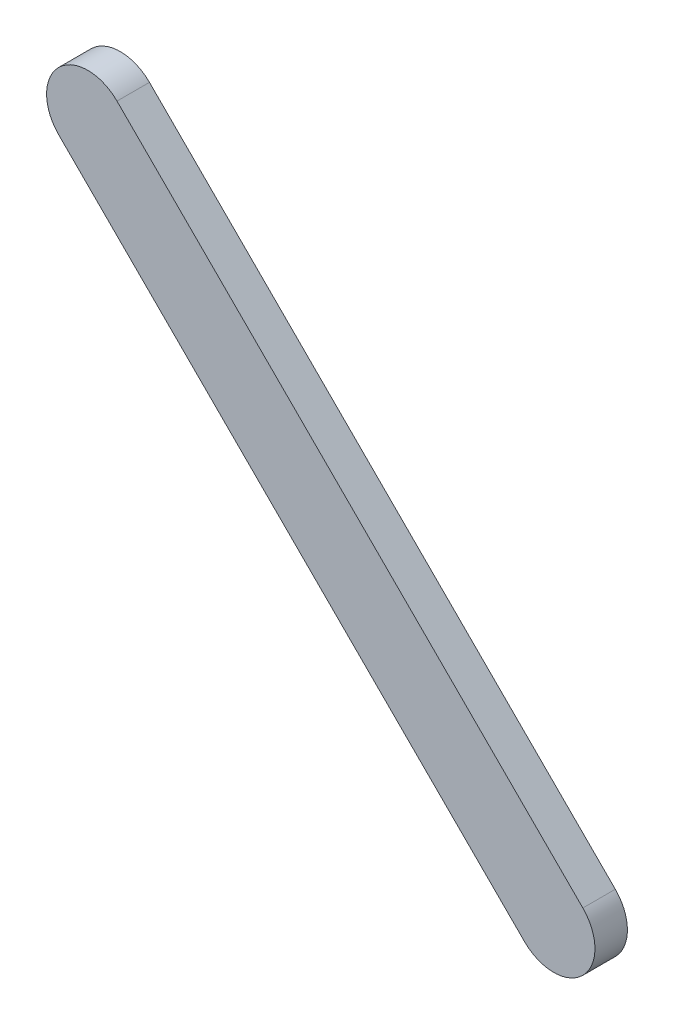
ISO-10303-21;
HEADER;
FILE_DESCRIPTION(('STEP AP214'),'2;1');
FILE_NAME('part.step','',(''),(''),'','','');
FILE_SCHEMA(('AUTOMOTIVE_DESIGN { 1 0 10303 214 1 1 1 1 }'));
ENDSEC;
DATA;
#1=APPLICATION_CONTEXT('core data for automotive mechanical design processes');
#2=APPLICATION_PROTOCOL_DEFINITION('international standard','automotive_design',2000,#1);
#3=PRODUCT_CONTEXT('',#1,'mechanical');
#4=PRODUCT('Part','Part','',(#3));
#5=PRODUCT_RELATED_PRODUCT_CATEGORY('part','',(#4));
#6=PRODUCT_DEFINITION_FORMATION('','',#4);
#7=PRODUCT_DEFINITION_CONTEXT('part definition',#1,'design');
#8=PRODUCT_DEFINITION('design','',#6,#7);
#9=PRODUCT_DEFINITION_SHAPE('','',#8);
#10=(LENGTH_UNIT() NAMED_UNIT(*) SI_UNIT(.MILLI.,.METRE.));
#11=(NAMED_UNIT(*) PLANE_ANGLE_UNIT() SI_UNIT($,.RADIAN.));
#12=(NAMED_UNIT(*) SI_UNIT($,.STERADIAN.) SOLID_ANGLE_UNIT());
#13=UNCERTAINTY_MEASURE_WITH_UNIT(LENGTH_MEASURE(1.E-05),#10,'distance_accuracy_value','');
#14=(GEOMETRIC_REPRESENTATION_CONTEXT(3) GLOBAL_UNCERTAINTY_ASSIGNED_CONTEXT((#13)) GLOBAL_UNIT_ASSIGNED_CONTEXT((#10,
#11,#12)) REPRESENTATION_CONTEXT('',''));
#15=CARTESIAN_POINT('',(0.,0.,0.));
#16=DIRECTION('',(0.,0.,1.));
#17=DIRECTION('',(1.,0.,0.));
#18=AXIS2_PLACEMENT_3D('',#15,#16,#17);
#19=CARTESIAN_POINT('',(146.25139406,59.3325966,0.));
#20=DIRECTION('',(0.707106781186548,0.707106781186548,0.));
#21=DIRECTION('',(0.707106781186548,-0.707106781186548,0.));
#22=AXIS2_PLACEMENT_3D('',#19,#20,#21);
#23=PLANE('',#22);
#24=DIRECTION('',(0.707106781186548,-0.707106781186548,0.));
#25=VECTOR('',#24,1.);
#26=CARTESIAN_POINT('',(146.25139406,59.3325966,0.1999996));
#27=LINE('',#26,#25);
#28=CARTESIAN_POINT('',(146.25139406,59.3325966,0.1999996));
#29=VERTEX_POINT('',#28);
#30=CARTESIAN_POINT('',(149.1215966,56.46239406,0.1999996));
#31=VERTEX_POINT('',#30);
#32=EDGE_CURVE('E11',#29,#31,#27,.T.);
#33=ORIENTED_EDGE('',*,*,#32,.F.);
#34=DIRECTION('',(0.,0.,1.));
#35=VECTOR('',#34,1.);
#36=CARTESIAN_POINT('',(146.25139406,59.3325966,0.));
#37=LINE('',#36,#35);
#38=CARTESIAN_POINT('',(146.25139406,59.3325966,0.));
#39=VERTEX_POINT('',#38);
#40=EDGE_CURVE('E24',#39,#29,#37,.T.);
#41=ORIENTED_EDGE('',*,*,#40,.F.);
#42=DIRECTION('',(0.707106781186548,-0.707106781186548,0.));
#43=VECTOR('',#42,1.);
#44=CARTESIAN_POINT('',(146.25139406,59.3325966,0.));
#45=LINE('',#44,#43);
#46=CARTESIAN_POINT('',(149.1215966,56.46239406,0.));
#47=VERTEX_POINT('',#46);
#48=EDGE_CURVE('E75',#39,#47,#45,.T.);
#49=ORIENTED_EDGE('',*,*,#48,.T.);
#50=DIRECTION('',(0.,0.,1.));
#51=VECTOR('',#50,1.);
#52=CARTESIAN_POINT('',(149.1215966,56.46239406,0.));
#53=LINE('',#52,#51);
#54=EDGE_CURVE('E37',#47,#31,#53,.T.);
#55=ORIENTED_EDGE('',*,*,#54,.T.);
#56=EDGE_LOOP('',(#33,#41,#49,#55));
#57=FACE_BOUND('',#56,.T.);
#58=ADVANCED_FACE('F17',(#57),#23,.F.);
#59=CARTESIAN_POINT('',(149.30120127,56.64199873,0.));
#60=DIRECTION('',(0.,0.,-1.));
#61=DIRECTION('',(-0.707106781186492,-0.707106781186603,0.));
#62=AXIS2_PLACEMENT_3D('',#59,#60,#61);
#63=CYLINDRICAL_SURFACE('',#62,0.253999360179542);
#64=CARTESIAN_POINT('',(149.30120127,56.64199873,0.1999996));
#65=DIRECTION('',(0.,0.,1.));
#66=DIRECTION('',(-0.707106781186492,-0.707106781186603,0.));
#67=AXIS2_PLACEMENT_3D('',#64,#65,#66);
#68=CIRCLE('',#67,0.253999360179542);
#69=CARTESIAN_POINT('',(149.48080594,56.8216034,0.1999996));
#70=VERTEX_POINT('',#69);
#71=EDGE_CURVE('E83',#31,#70,#68,.T.);
#72=ORIENTED_EDGE('',*,*,#71,.F.);
#73=ORIENTED_EDGE('',*,*,#54,.F.);
#74=CARTESIAN_POINT('',(149.30120127,56.64199873,0.));
#75=DIRECTION('',(0.,0.,1.));
#76=DIRECTION('',(-0.707106781186492,-0.707106781186603,0.));
#77=AXIS2_PLACEMENT_3D('',#74,#75,#76);
#78=CIRCLE('',#77,0.253999360179542);
#79=CARTESIAN_POINT('',(149.48080594,56.8216034,0.));
#80=VERTEX_POINT('',#79);
#81=EDGE_CURVE('E81',#47,#80,#78,.T.);
#82=ORIENTED_EDGE('',*,*,#81,.T.);
#83=DIRECTION('',(0.,0.,1.));
#84=VECTOR('',#83,1.);
#85=CARTESIAN_POINT('',(149.48080594,56.8216034,0.));
#86=LINE('',#85,#84);
#87=EDGE_CURVE('E67',#80,#70,#86,.T.);
#88=ORIENTED_EDGE('',*,*,#87,.T.);
#89=EDGE_LOOP('',(#72,#73,#82,#88));
#90=FACE_BOUND('',#89,.T.);
#91=ADVANCED_FACE('F89',(#90),#63,.T.);
#92=CARTESIAN_POINT('',(149.48080594,56.8216034,0.));
#93=DIRECTION('',(-0.70710678118655,-0.707106781186545,0.));
#94=DIRECTION('',(-0.707106781186545,0.70710678118655,0.));
#95=AXIS2_PLACEMENT_3D('',#92,#93,#94);
#96=PLANE('',#95);
#97=DIRECTION('',(-0.707106781186545,0.70710678118655,0.));
#98=VECTOR('',#97,1.);
#99=CARTESIAN_POINT('',(149.48080594,56.8216034,0.1999996));
#100=LINE('',#99,#98);
#101=CARTESIAN_POINT('',(146.6106034,59.69180594,0.1999996));
#102=VERTEX_POINT('',#101);
#103=EDGE_CURVE('E71',#70,#102,#100,.T.);
#104=ORIENTED_EDGE('',*,*,#103,.F.);
#105=ORIENTED_EDGE('',*,*,#87,.F.);
#106=DIRECTION('',(-0.707106781186545,0.70710678118655,0.));
#107=VECTOR('',#106,1.);
#108=CARTESIAN_POINT('',(149.48080594,56.8216034,0.));
#109=LINE('',#108,#107);
#110=CARTESIAN_POINT('',(146.6106034,59.69180594,0.));
#111=VERTEX_POINT('',#110);
#112=EDGE_CURVE('E63',#80,#111,#109,.T.);
#113=ORIENTED_EDGE('',*,*,#112,.T.);
#114=DIRECTION('',(0.,0.,1.));
#115=VECTOR('',#114,1.);
#116=CARTESIAN_POINT('',(146.6106034,59.69180594,0.));
#117=LINE('',#116,#115);
#118=EDGE_CURVE('E53',#111,#102,#117,.T.);
#119=ORIENTED_EDGE('',*,*,#118,.T.);
#120=EDGE_LOOP('',(#104,#105,#113,#119));
#121=FACE_BOUND('',#120,.T.);
#122=ADVANCED_FACE('F66',(#121),#96,.F.);
#123=CARTESIAN_POINT('',(146.43099873,59.51220127,0.));
#124=DIRECTION('',(0.,0.,-1.));
#125=DIRECTION('',(0.707106781186562,0.707106781186534,0.));
#126=AXIS2_PLACEMENT_3D('',#123,#124,#125);
#127=CYLINDRICAL_SURFACE('',#126,0.253999360179546);
#128=CARTESIAN_POINT('',(146.43099873,59.51220127,0.1999996));
#129=DIRECTION('',(0.,0.,1.));
#130=DIRECTION('',(0.707106781186562,0.707106781186534,0.));
#131=AXIS2_PLACEMENT_3D('',#128,#129,#130);
#132=CIRCLE('',#131,0.253999360179546);
#133=EDGE_CURVE('E59',#102,#29,#132,.T.);
#134=ORIENTED_EDGE('',*,*,#133,.F.);
#135=ORIENTED_EDGE('',*,*,#118,.F.);
#136=CARTESIAN_POINT('',(146.43099873,59.51220127,0.));
#137=DIRECTION('',(0.,0.,1.));
#138=DIRECTION('',(0.707106781186562,0.707106781186534,0.));
#139=AXIS2_PLACEMENT_3D('',#136,#137,#138);
#140=CIRCLE('',#139,0.253999360179546);
#141=EDGE_CURVE('E57',#111,#39,#140,.T.);
#142=ORIENTED_EDGE('',*,*,#141,.T.);
#143=ORIENTED_EDGE('',*,*,#40,.T.);
#144=EDGE_LOOP('',(#134,#135,#142,#143));
#145=FACE_BOUND('',#144,.T.);
#146=ADVANCED_FACE('F55',(#145),#127,.T.);
#147=CARTESIAN_POINT('',(146.25139406,59.3325966,0.));
#148=DIRECTION('',(0.,0.,-1.));
#149=DIRECTION('',(-1.,0.,0.));
#150=AXIS2_PLACEMENT_3D('',#147,#148,#149);
#151=PLANE('',#150);
#152=ORIENTED_EDGE('',*,*,#141,.F.);
#153=ORIENTED_EDGE('',*,*,#112,.F.);
#154=ORIENTED_EDGE('',*,*,#81,.F.);
#155=ORIENTED_EDGE('',*,*,#48,.F.);
#156=EDGE_LOOP('',(#152,#153,#154,#155));
#157=FACE_BOUND('',#156,.T.);
#158=ADVANCED_FACE('F74',(#157),#151,.T.);
#159=CARTESIAN_POINT('',(146.25139406,59.3325966,0.1999996));
#160=DIRECTION('',(0.,0.,-1.));
#161=DIRECTION('',(-1.,0.,0.));
#162=AXIS2_PLACEMENT_3D('',#159,#160,#161);
#163=PLANE('',#162);
#164=ORIENTED_EDGE('',*,*,#32,.T.);
#165=ORIENTED_EDGE('',*,*,#71,.T.);
#166=ORIENTED_EDGE('',*,*,#103,.T.);
#167=ORIENTED_EDGE('',*,*,#133,.T.);
#168=EDGE_LOOP('',(#164,#165,#166,#167));
#169=FACE_BOUND('',#168,.T.);
#170=ADVANCED_FACE('F91',(#169),#163,.F.);
#171=CLOSED_SHELL('',(#58,#91,#122,#146,#158,#170));
#172=MANIFOLD_SOLID_BREP('B1',#171);
#173=ADVANCED_BREP_SHAPE_REPRESENTATION('',(#18,#172),#14);
#174=SHAPE_DEFINITION_REPRESENTATION(#9,#173);
ENDSEC;
END-ISO-10303-21;
